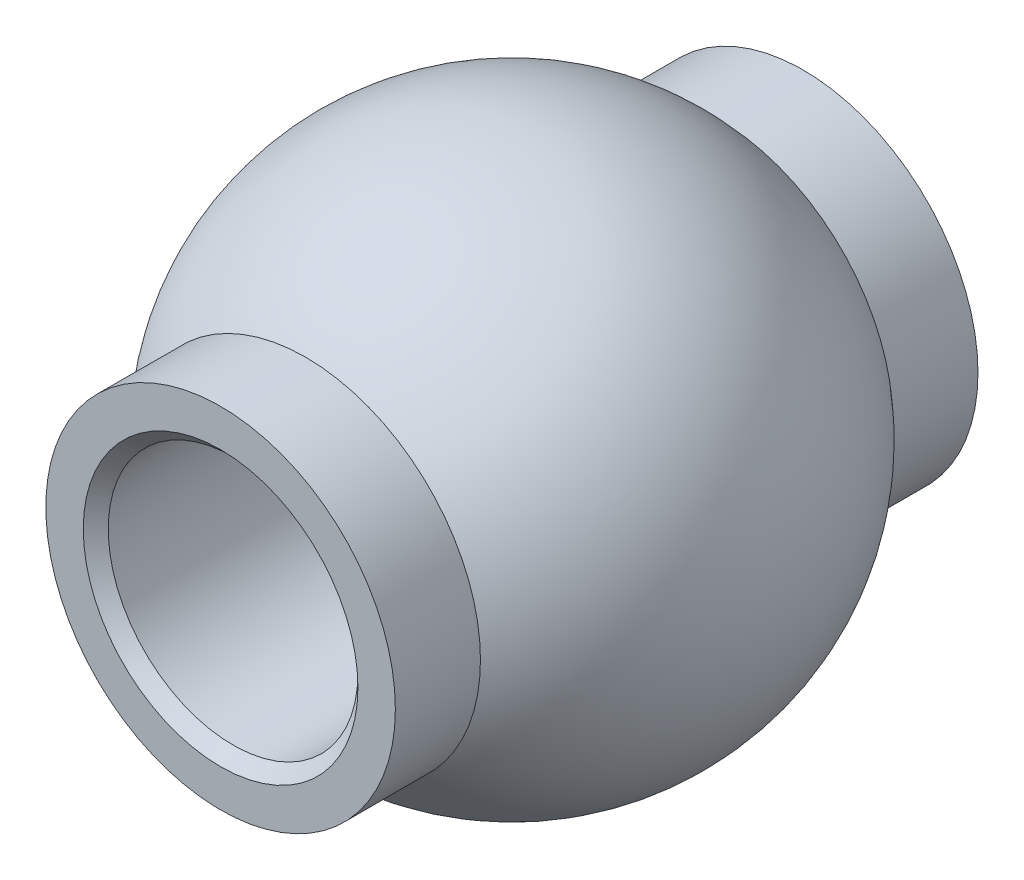
ISO-10303-21;
HEADER;
FILE_DESCRIPTION(('STEP AP214'),'2;1');
FILE_NAME('part.step','',(''),(''),'','','');
FILE_SCHEMA(('AUTOMOTIVE_DESIGN { 1 0 10303 214 1 1 1 1 }'));
ENDSEC;
DATA;
#1=APPLICATION_CONTEXT('core data for automotive mechanical design processes');
#2=APPLICATION_PROTOCOL_DEFINITION('international standard','automotive_design',2000,#1);
#3=PRODUCT_CONTEXT('',#1,'mechanical');
#4=PRODUCT('Part','Part','',(#3));
#5=PRODUCT_RELATED_PRODUCT_CATEGORY('part','',(#4));
#6=PRODUCT_DEFINITION_FORMATION('','',#4);
#7=PRODUCT_DEFINITION_CONTEXT('part definition',#1,'design');
#8=PRODUCT_DEFINITION('design','',#6,#7);
#9=PRODUCT_DEFINITION_SHAPE('','',#8);
#10=(LENGTH_UNIT() NAMED_UNIT(*) SI_UNIT(.MILLI.,.METRE.));
#11=(NAMED_UNIT(*) PLANE_ANGLE_UNIT() SI_UNIT($,.RADIAN.));
#12=(NAMED_UNIT(*) SI_UNIT($,.STERADIAN.) SOLID_ANGLE_UNIT());
#13=UNCERTAINTY_MEASURE_WITH_UNIT(LENGTH_MEASURE(1.E-05),#10,'distance_accuracy_value','');
#14=(GEOMETRIC_REPRESENTATION_CONTEXT(3) GLOBAL_UNCERTAINTY_ASSIGNED_CONTEXT((#13)) GLOBAL_UNIT_ASSIGNED_CONTEXT((#10,
#11,#12)) REPRESENTATION_CONTEXT('',''));
#15=CARTESIAN_POINT('',(0.,0.,0.));
#16=DIRECTION('',(0.,0.,1.));
#17=DIRECTION('',(1.,0.,0.));
#18=AXIS2_PLACEMENT_3D('',#15,#16,#17);
#19=CARTESIAN_POINT('',(0.,26.9875,-11.1125));
#20=DIRECTION('',(0.,0.,1.));
#21=DIRECTION('',(1.,0.,0.));
#22=AXIS2_PLACEMENT_3D('',#19,#20,#21);
#23=CYLINDRICAL_SURFACE('',#22,6.6675);
#24=CARTESIAN_POINT('',(0.,26.9875,7.86702215008958));
#25=DIRECTION('',(0.,0.,-1.));
#26=DIRECTION('',(-1.,0.,0.));
#27=AXIS2_PLACEMENT_3D('',#24,#25,#26);
#28=CIRCLE('',#27,6.6675);
#29=CARTESIAN_POINT('',(-6.66749999999999,26.9875,7.86702215008958));
#30=VERTEX_POINT('',#29);
#31=EDGE_CURVE('E71',#30,#30,#28,.F.);
#32=ORIENTED_EDGE('',*,*,#31,.T.);
#33=EDGE_LOOP('',(#32));
#34=FACE_BOUND('',#33,.T.);
#35=CARTESIAN_POINT('',(0.,26.9875,11.1125));
#36=DIRECTION('',(0.,0.,1.));
#37=DIRECTION('',(1.,0.,0.));
#38=AXIS2_PLACEMENT_3D('',#35,#36,#37);
#39=CIRCLE('',#38,6.6675);
#40=CARTESIAN_POINT('',(6.66750000000001,26.9875,11.1125));
#41=VERTEX_POINT('',#40);
#42=EDGE_CURVE('E83',#41,#41,#39,.T.);
#43=ORIENTED_EDGE('',*,*,#42,.F.);
#44=EDGE_LOOP('',(#43));
#45=FACE_BOUND('',#44,.T.);
#46=ADVANCED_FACE('F47',(#34,#45),#23,.T.);
#47=CARTESIAN_POINT('',(0.,26.9875,11.1125));
#48=DIRECTION('',(0.,0.,1.));
#49=DIRECTION('',(1.,0.,0.));
#50=AXIS2_PLACEMENT_3D('',#47,#48,#49);
#51=PLANE('',#50);
#52=CARTESIAN_POINT('',(0.,26.9875,11.1125));
#53=DIRECTION('',(0.,0.,1.));
#54=DIRECTION('',(1.,0.,0.));
#55=AXIS2_PLACEMENT_3D('',#52,#53,#54);
#56=CIRCLE('',#55,5.23875);
#57=CARTESIAN_POINT('',(5.23875000000001,26.9875,11.1125));
#58=VERTEX_POINT('',#57);
#59=EDGE_CURVE('E11',#58,#58,#56,.F.);
#60=ORIENTED_EDGE('',*,*,#59,.T.);
#61=EDGE_LOOP('',(#60));
#62=FACE_BOUND('',#61,.T.);
#63=ORIENTED_EDGE('',*,*,#42,.T.);
#64=EDGE_LOOP('',(#63));
#65=FACE_BOUND('',#64,.T.);
#66=ADVANCED_FACE('F89',(#62,#65),#51,.T.);
#67=CARTESIAN_POINT('',(0.,26.9875,0.));
#68=DIRECTION('',(0.,-1.,0.));
#69=DIRECTION('',(1.,0.,0.));
#70=AXIS2_PLACEMENT_3D('',#67,#68,#69);
#71=SPHERICAL_SURFACE('',#70,10.3124);
#72=CARTESIAN_POINT('',(0.,26.9875,0.));
#73=DIRECTION('',(0.,0.,-1.));
#74=DIRECTION('',(-1.,0.,0.));
#75=AXIS2_PLACEMENT_3D('',#72,#73,#74);
#76=SPHERICAL_SURFACE('',#75,10.3124);
#77=ORIENTED_EDGE('',*,*,#31,.F.);
#78=EDGE_LOOP('',(#77));
#79=FACE_BOUND('',#78,.T.);
#80=CARTESIAN_POINT('',(0.,26.9875,-7.86702215008958));
#81=DIRECTION('',(0.,0.,1.));
#82=DIRECTION('',(1.,0.,0.));
#83=AXIS2_PLACEMENT_3D('',#80,#81,#82);
#84=CIRCLE('',#83,6.6675);
#85=CARTESIAN_POINT('',(6.66750000000001,26.9875,-7.86702215008958));
#86=VERTEX_POINT('',#85);
#87=EDGE_CURVE('E75',#86,#86,#84,.F.);
#88=ORIENTED_EDGE('',*,*,#87,.F.);
#89=EDGE_LOOP('',(#88));
#90=FACE_BOUND('',#89,.T.);
#91=ADVANCED_FACE('F98',(#79,#90),#76,.T.);
#92=CARTESIAN_POINT('',(0.,26.9875,-11.1125));
#93=DIRECTION('',(0.,0.,1.));
#94=DIRECTION('',(1.,0.,0.));
#95=AXIS2_PLACEMENT_3D('',#92,#93,#94);
#96=PLANE('',#95);
#97=CARTESIAN_POINT('',(0.,26.9875,-11.1125));
#98=DIRECTION('',(0.,0.,1.));
#99=DIRECTION('',(1.,0.,0.));
#100=AXIS2_PLACEMENT_3D('',#97,#98,#99);
#101=CIRCLE('',#100,5.23875);
#102=CARTESIAN_POINT('',(-5.23874999999999,26.9875,-11.1125));
#103=VERTEX_POINT('',#102);
#104=EDGE_CURVE('E65',#103,#103,#101,.T.);
#105=ORIENTED_EDGE('',*,*,#104,.T.);
#106=EDGE_LOOP('',(#105));
#107=FACE_BOUND('',#106,.T.);
#108=CARTESIAN_POINT('',(0.,26.9875,-11.1125));
#109=DIRECTION('',(0.,0.,1.));
#110=DIRECTION('',(1.,0.,0.));
#111=AXIS2_PLACEMENT_3D('',#108,#109,#110);
#112=CIRCLE('',#111,6.6675);
#113=CARTESIAN_POINT('',(6.66750000000001,26.9875,-11.1125));
#114=VERTEX_POINT('',#113);
#115=EDGE_CURVE('E78',#114,#114,#112,.T.);
#116=ORIENTED_EDGE('',*,*,#115,.F.);
#117=EDGE_LOOP('',(#116));
#118=FACE_BOUND('',#117,.T.);
#119=ADVANCED_FACE('F104',(#107,#118),#96,.F.);
#120=ORIENTED_EDGE('',*,*,#87,.T.);
#121=EDGE_LOOP('',(#120));
#122=FACE_BOUND('',#121,.T.);
#123=ORIENTED_EDGE('',*,*,#115,.T.);
#124=EDGE_LOOP('',(#123));
#125=FACE_BOUND('',#124,.T.);
#126=ADVANCED_FACE('F94',(#122,#125),#23,.T.);
#127=CARTESIAN_POINT('',(0.,26.9875,-11.1125));
#128=DIRECTION('',(0.,0.,1.));
#129=DIRECTION('',(1.,0.,0.));
#130=AXIS2_PLACEMENT_3D('',#127,#128,#129);
#131=CYLINDRICAL_SURFACE('',#130,4.7625);
#132=CARTESIAN_POINT('',(0.,26.9875,-10.63625));
#133=DIRECTION('',(0.,0.,1.));
#134=DIRECTION('',(1.,0.,0.));
#135=AXIS2_PLACEMENT_3D('',#132,#133,#134);
#136=CIRCLE('',#135,4.7625);
#137=CARTESIAN_POINT('',(-4.76249999999999,26.9875,-10.63625));
#138=VERTEX_POINT('',#137);
#139=EDGE_CURVE('E55',#138,#138,#136,.F.);
#140=ORIENTED_EDGE('',*,*,#139,.T.);
#141=EDGE_LOOP('',(#140));
#142=FACE_BOUND('',#141,.T.);
#143=CARTESIAN_POINT('',(0.,26.9875,10.63625));
#144=DIRECTION('',(0.,0.,1.));
#145=DIRECTION('',(1.,0.,0.));
#146=AXIS2_PLACEMENT_3D('',#143,#144,#145);
#147=CIRCLE('',#146,4.7625);
#148=CARTESIAN_POINT('',(4.76250000000001,26.9875,10.63625));
#149=VERTEX_POINT('',#148);
#150=EDGE_CURVE('E60',#149,#149,#147,.T.);
#151=ORIENTED_EDGE('',*,*,#150,.T.);
#152=EDGE_LOOP('',(#151));
#153=FACE_BOUND('',#152,.T.);
#154=ADVANCED_FACE('F103',(#142,#153),#131,.F.);
#155=CARTESIAN_POINT('',(0.,26.9875,-11.1125));
#156=DIRECTION('',(0.,0.,-1.));
#157=DIRECTION('',(-1.,0.,0.));
#158=AXIS2_PLACEMENT_3D('',#155,#156,#157);
#159=CONICAL_SURFACE('',#158,5.23875,0.785398163397447);
#160=CARTESIAN_POINT('',(-4.76249999999999,26.9875,-10.63625));
#161=CARTESIAN_POINT('',(-4.76746093749999,26.9875,-10.6412109375));
#162=CARTESIAN_POINT('',(-4.77242187499999,26.9875,-10.646171875));
#163=CARTESIAN_POINT('',(-4.78234374999999,26.9875,-10.65609375));
#164=CARTESIAN_POINT('',(-4.78730468749999,26.9875,-10.6610546875));
#165=CARTESIAN_POINT('',(-4.79722656249999,26.9875,-10.6709765625));
#166=CARTESIAN_POINT('',(-4.80218749999999,26.9875,-10.6759375));
#167=CARTESIAN_POINT('',(-4.81210937499999,26.9875,-10.685859375));
#168=CARTESIAN_POINT('',(-4.81707031249999,26.9875,-10.6908203125));
#169=CARTESIAN_POINT('',(-4.82699218749999,26.9875,-10.7007421875));
#170=CARTESIAN_POINT('',(-4.83195312499999,26.9875,-10.705703125));
#171=CARTESIAN_POINT('',(-4.84187499999999,26.9875,-10.715625));
#172=CARTESIAN_POINT('',(-4.84683593749999,26.9875,-10.7205859375));
#173=CARTESIAN_POINT('',(-4.85675781249999,26.9875,-10.7305078125));
#174=CARTESIAN_POINT('',(-4.86171874999999,26.9875,-10.73546875));
#175=CARTESIAN_POINT('',(-4.87164062499999,26.9875,-10.745390625));
#176=CARTESIAN_POINT('',(-4.87660156249999,26.9875,-10.7503515625));
#177=CARTESIAN_POINT('',(-4.88652343749999,26.9875,-10.7602734375));
#178=CARTESIAN_POINT('',(-4.89148437499999,26.9875,-10.765234375));
#179=CARTESIAN_POINT('',(-4.90140624999999,26.9875,-10.77515625));
#180=CARTESIAN_POINT('',(-4.90636718749999,26.9875,-10.7801171875));
#181=CARTESIAN_POINT('',(-4.91628906249999,26.9875,-10.7900390625));
#182=CARTESIAN_POINT('',(-4.92124999999999,26.9875,-10.795));
#183=CARTESIAN_POINT('',(-4.93117187499999,26.9875,-10.804921875));
#184=CARTESIAN_POINT('',(-4.93613281249999,26.9875,-10.8098828125));
#185=CARTESIAN_POINT('',(-4.94605468749999,26.9875,-10.8198046875));
#186=CARTESIAN_POINT('',(-4.95101562499999,26.9875,-10.824765625));
#187=CARTESIAN_POINT('',(-4.96093749999999,26.9875,-10.8346875));
#188=CARTESIAN_POINT('',(-4.96589843749999,26.9875,-10.8396484375));
#189=CARTESIAN_POINT('',(-4.97582031249999,26.9875,-10.8495703125));
#190=CARTESIAN_POINT('',(-4.98078124999999,26.9875,-10.85453125));
#191=CARTESIAN_POINT('',(-4.99070312499999,26.9875,-10.864453125));
#192=CARTESIAN_POINT('',(-4.99566406249999,26.9875,-10.8694140625));
#193=CARTESIAN_POINT('',(-5.00558593749999,26.9875,-10.8793359375));
#194=CARTESIAN_POINT('',(-5.01054687499999,26.9875,-10.884296875));
#195=CARTESIAN_POINT('',(-5.02046874999999,26.9875,-10.89421875));
#196=CARTESIAN_POINT('',(-5.02542968749999,26.9875,-10.8991796875));
#197=CARTESIAN_POINT('',(-5.03535156249999,26.9875,-10.9091015625));
#198=CARTESIAN_POINT('',(-5.04031249999999,26.9875,-10.9140625));
#199=CARTESIAN_POINT('',(-5.05023437499999,26.9875,-10.923984375));
#200=CARTESIAN_POINT('',(-5.05519531249999,26.9875,-10.9289453125));
#201=CARTESIAN_POINT('',(-5.06511718749999,26.9875,-10.9388671875));
#202=CARTESIAN_POINT('',(-5.07007812499999,26.9875,-10.943828125));
#203=CARTESIAN_POINT('',(-5.07999999999999,26.9875,-10.95375));
#204=CARTESIAN_POINT('',(-5.08496093749999,26.9875,-10.9587109375));
#205=CARTESIAN_POINT('',(-5.09488281249999,26.9875,-10.9686328125));
#206=CARTESIAN_POINT('',(-5.09984374999999,26.9875,-10.97359375));
#207=CARTESIAN_POINT('',(-5.10976562499999,26.9875,-10.983515625));
#208=CARTESIAN_POINT('',(-5.11472656249999,26.9875,-10.9884765625));
#209=CARTESIAN_POINT('',(-5.12464843749999,26.9875,-10.9983984375));
#210=CARTESIAN_POINT('',(-5.12960937499999,26.9875,-11.003359375));
#211=CARTESIAN_POINT('',(-5.13953124999999,26.9875,-11.01328125));
#212=CARTESIAN_POINT('',(-5.14449218749999,26.9875,-11.0182421875));
#213=CARTESIAN_POINT('',(-5.15441406249999,26.9875,-11.0281640625));
#214=CARTESIAN_POINT('',(-5.15937499999999,26.9875,-11.033125));
#215=CARTESIAN_POINT('',(-5.16929687499999,26.9875,-11.043046875));
#216=CARTESIAN_POINT('',(-5.17425781249999,26.9875,-11.0480078125));
#217=CARTESIAN_POINT('',(-5.18417968749999,26.9875,-11.0579296875));
#218=CARTESIAN_POINT('',(-5.18914062499999,26.9875,-11.062890625));
#219=CARTESIAN_POINT('',(-5.19906249999999,26.9875,-11.0728125));
#220=CARTESIAN_POINT('',(-5.20402343749999,26.9875,-11.0777734375));
#221=CARTESIAN_POINT('',(-5.21394531249999,26.9875,-11.0876953125));
#222=CARTESIAN_POINT('',(-5.21890624999999,26.9875,-11.09265625));
#223=CARTESIAN_POINT('',(-5.22882812499999,26.9875,-11.102578125));
#224=CARTESIAN_POINT('',(-5.23378906249999,26.9875,-11.1075390625));
#225=CARTESIAN_POINT('',(-5.23874999999999,26.9875,-11.1125));
#226=B_SPLINE_CURVE_WITH_KNOTS('',3,(#160,#161,#162,#163,#164,#165,#166,#167,#168,#169,#170,
#171,#172,#173,#174,#175,#176,#177,#178,#179,#180,#181,#182,#183,#184,#185,#186,#187,#188,#189,
#190,#191,#192,#193,#194,#195,#196,#197,#198,#199,#200,#201,#202,#203,#204,#205,#206,#207,#208,
#209,#210,#211,#212,#213,#214,#215,#216,#217,#218,#219,#220,#221,#222,#223,#224,#225),
.UNSPECIFIED.,.F.,.F.,(4,2,2,2,2,2,2,2,2,2,2,2,2,2,2,2,2,2,2,2,2,2,2,2,2,2,2,2,2,2,2,2,4),(0.,
0.0210474752837557,0.0420949505675121,0.0631424258512684,0.0841899011350241,0.10523737641878,
0.126284851702535,0.147332326986291,0.168379802270047,0.189427277553803,0.210474752837559,
0.231522228121314,0.25256970340507,0.273617178688826,0.294664653972583,0.315712129256338,
0.336759604540093,0.35780707982385,0.378854555107605,0.399902030391362,0.420949505675117,
0.441996980958874,0.463044456242628,0.484091931526384,0.50513940681014,0.526186882093897,
0.547234357377653,0.568281832661407,0.589329307945164,0.610376783228919,0.631424258512676,
0.652471733796431,0.673519209080187),.UNSPECIFIED.);
#227=EDGE_CURVE('BSEAM110',#138,#103,#226,.T.);
#228=ORIENTED_EDGE('',*,*,#139,.F.);
#229=ORIENTED_EDGE('',*,*,#104,.F.);
#230=ORIENTED_EDGE('',*,*,#227,.T.);
#231=ORIENTED_EDGE('',*,*,#227,.F.);
#232=EDGE_LOOP('',(#228,#230,#229,#231));
#233=FACE_BOUND('',#232,.T.);
#234=ADVANCED_FACE('F110',(#233),#159,.F.);
#235=CARTESIAN_POINT('',(0.,26.9875,10.63625));
#236=DIRECTION('',(0.,0.,1.));
#237=DIRECTION('',(1.,0.,0.));
#238=AXIS2_PLACEMENT_3D('',#235,#236,#237);
#239=CONICAL_SURFACE('',#238,4.7625,0.785398163397454);
#240=ORIENTED_EDGE('',*,*,#59,.F.);
#241=EDGE_LOOP('',(#240));
#242=FACE_BOUND('',#241,.T.);
#243=ORIENTED_EDGE('',*,*,#150,.F.);
#244=EDGE_LOOP('',(#243));
#245=FACE_BOUND('',#244,.T.);
#246=ADVANCED_FACE('F49',(#242,#245),#239,.F.);
#247=CLOSED_SHELL('',(#46,#66,#91,#119,#126,#154,#234,#246));
#248=MANIFOLD_SOLID_BREP('B2',#247);
#249=ADVANCED_BREP_SHAPE_REPRESENTATION('',(#18,#248),#14);
#250=SHAPE_DEFINITION_REPRESENTATION(#9,#249);
ENDSEC;
END-ISO-10303-21;
